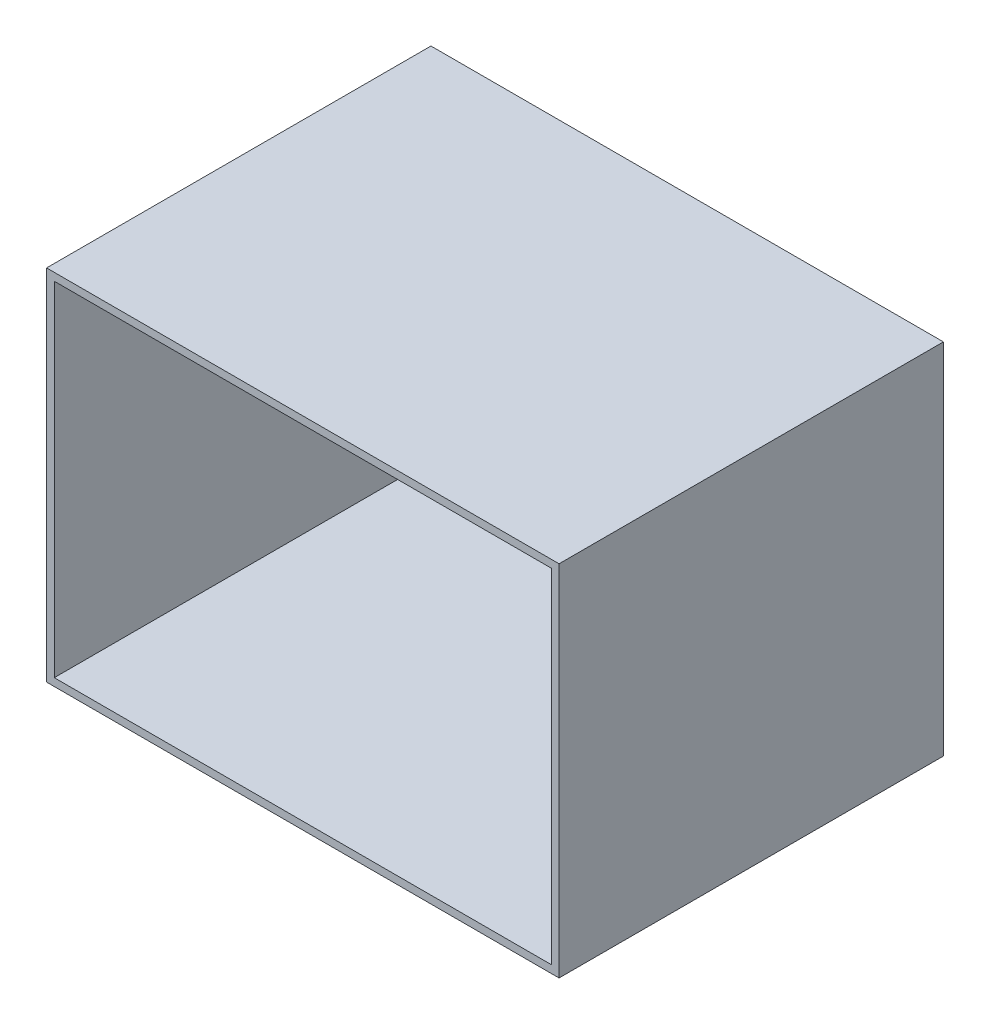
ISO-10303-21;
HEADER;
FILE_DESCRIPTION(('STEP AP214'),'2;1');
FILE_NAME('part.step','',(''),(''),'','','');
FILE_SCHEMA(('AUTOMOTIVE_DESIGN { 1 0 10303 214 1 1 1 1 }'));
ENDSEC;
DATA;
#1=APPLICATION_CONTEXT('core data for automotive mechanical design processes');
#2=APPLICATION_PROTOCOL_DEFINITION('international standard','automotive_design',2000,#1);
#3=PRODUCT_CONTEXT('',#1,'mechanical');
#4=PRODUCT('Part','Part','',(#3));
#5=PRODUCT_RELATED_PRODUCT_CATEGORY('part','',(#4));
#6=PRODUCT_DEFINITION_FORMATION('','',#4);
#7=PRODUCT_DEFINITION_CONTEXT('part definition',#1,'design');
#8=PRODUCT_DEFINITION('design','',#6,#7);
#9=PRODUCT_DEFINITION_SHAPE('','',#8);
#10=(LENGTH_UNIT() NAMED_UNIT(*) SI_UNIT(.MILLI.,.METRE.));
#11=(NAMED_UNIT(*) PLANE_ANGLE_UNIT() SI_UNIT($,.RADIAN.));
#12=(NAMED_UNIT(*) SI_UNIT($,.STERADIAN.) SOLID_ANGLE_UNIT());
#13=UNCERTAINTY_MEASURE_WITH_UNIT(LENGTH_MEASURE(1.E-05),#10,'distance_accuracy_value','');
#14=(GEOMETRIC_REPRESENTATION_CONTEXT(3) GLOBAL_UNCERTAINTY_ASSIGNED_CONTEXT((#13)) GLOBAL_UNIT_ASSIGNED_CONTEXT((#10,
#11,#12)) REPRESENTATION_CONTEXT('',''));
#15=CARTESIAN_POINT('',(0.,0.,0.));
#16=DIRECTION('',(0.,0.,1.));
#17=DIRECTION('',(1.,0.,0.));
#18=AXIS2_PLACEMENT_3D('',#15,#16,#17);
#19=CARTESIAN_POINT('',(0.,3.,0.));
#20=DIRECTION('',(0.,-1.,0.));
#21=DIRECTION('',(0.,0.,-1.));
#22=AXIS2_PLACEMENT_3D('',#19,#20,#21);
#23=PLANE('',#22);
#24=DIRECTION('',(0.,0.,1.));
#25=VECTOR('',#24,1.);
#26=CARTESIAN_POINT('',(197.,3.,-150.));
#27=LINE('',#26,#25);
#28=CARTESIAN_POINT('',(197.,3.,-150.));
#29=VERTEX_POINT('',#28);
#30=CARTESIAN_POINT('',(197.,3.,0.));
#31=VERTEX_POINT('',#30);
#32=EDGE_CURVE('E137',#29,#31,#27,.T.);
#33=ORIENTED_EDGE('',*,*,#32,.F.);
#34=DIRECTION('',(-1.,0.,0.));
#35=VECTOR('',#34,1.);
#36=CARTESIAN_POINT('',(0.,3.,-150.));
#37=LINE('',#36,#35);
#38=CARTESIAN_POINT('',(3.,3.,-150.));
#39=VERTEX_POINT('',#38);
#40=EDGE_CURVE('E171',#29,#39,#37,.T.);
#41=ORIENTED_EDGE('',*,*,#40,.T.);
#42=DIRECTION('',(0.,0.,-1.));
#43=VECTOR('',#42,1.);
#44=CARTESIAN_POINT('',(3.,3.,-150.));
#45=LINE('',#44,#43);
#46=CARTESIAN_POINT('',(3.00000000000001,3.,0.));
#47=VERTEX_POINT('',#46);
#48=EDGE_CURVE('E60',#47,#39,#45,.T.);
#49=ORIENTED_EDGE('',*,*,#48,.F.);
#50=DIRECTION('',(1.,0.,0.));
#51=VECTOR('',#50,1.);
#52=CARTESIAN_POINT('',(0.,3.,0.));
#53=LINE('',#52,#51);
#54=EDGE_CURVE('E55',#47,#31,#53,.T.);
#55=ORIENTED_EDGE('',*,*,#54,.T.);
#56=EDGE_LOOP('',(#33,#41,#49,#55));
#57=FACE_BOUND('',#56,.T.);
#58=ADVANCED_FACE('F39',(#57),#23,.F.);
#59=CARTESIAN_POINT('',(0.,3.,0.));
#60=DIRECTION('',(1.,0.,0.));
#61=DIRECTION('',(0.,0.,-1.));
#62=AXIS2_PLACEMENT_3D('',#59,#60,#61);
#63=PLANE('',#62);
#64=DIRECTION('',(0.,0.,1.));
#65=VECTOR('',#64,1.);
#66=CARTESIAN_POINT('',(0.,0.,0.));
#67=LINE('',#66,#65);
#68=CARTESIAN_POINT('',(0.,0.,-150.));
#69=VERTEX_POINT('',#68);
#70=CARTESIAN_POINT('',(0.,0.,0.));
#71=VERTEX_POINT('',#70);
#72=EDGE_CURVE('E109',#69,#71,#67,.T.);
#73=ORIENTED_EDGE('',*,*,#72,.T.);
#74=DIRECTION('',(0.,-1.,0.));
#75=VECTOR('',#74,1.);
#76=CARTESIAN_POINT('',(0.,3.,0.));
#77=LINE('',#76,#75);
#78=CARTESIAN_POINT('',(0.,140.,0.));
#79=VERTEX_POINT('',#78);
#80=EDGE_CURVE('E11',#79,#71,#77,.T.);
#81=ORIENTED_EDGE('',*,*,#80,.F.);
#82=DIRECTION('',(0.,0.,1.));
#83=VECTOR('',#82,1.);
#84=CARTESIAN_POINT('',(0.,140.,-150.));
#85=LINE('',#84,#83);
#86=CARTESIAN_POINT('',(0.,140.,-150.));
#87=VERTEX_POINT('',#86);
#88=EDGE_CURVE('E107',#87,#79,#85,.T.);
#89=ORIENTED_EDGE('',*,*,#88,.F.);
#90=DIRECTION('',(0.,-1.,0.));
#91=VECTOR('',#90,1.);
#92=CARTESIAN_POINT('',(0.,3.,-150.));
#93=LINE('',#92,#91);
#94=EDGE_CURVE('E175',#87,#69,#93,.T.);
#95=ORIENTED_EDGE('',*,*,#94,.T.);
#96=EDGE_LOOP('',(#73,#81,#89,#95));
#97=FACE_BOUND('',#96,.T.);
#98=ADVANCED_FACE('F41',(#97),#63,.F.);
#99=CARTESIAN_POINT('',(0.,3.,0.));
#100=DIRECTION('',(0.,0.,-1.));
#101=DIRECTION('',(-1.,0.,0.));
#102=AXIS2_PLACEMENT_3D('',#99,#100,#101);
#103=PLANE('',#102);
#104=DIRECTION('',(0.,-1.,0.));
#105=VECTOR('',#104,1.);
#106=CARTESIAN_POINT('',(3.00000000000002,137.,0.));
#107=LINE('',#106,#105);
#108=CARTESIAN_POINT('',(3.00000000000002,137.,0.));
#109=VERTEX_POINT('',#108);
#110=EDGE_CURVE('E165',#109,#47,#107,.T.);
#111=ORIENTED_EDGE('',*,*,#110,.F.);
#112=DIRECTION('',(1.,0.,0.));
#113=VECTOR('',#112,1.);
#114=CARTESIAN_POINT('',(0.,137.,0.));
#115=LINE('',#114,#113);
#116=CARTESIAN_POINT('',(197.,137.,0.));
#117=VERTEX_POINT('',#116);
#118=EDGE_CURVE('E130',#109,#117,#115,.T.);
#119=ORIENTED_EDGE('',*,*,#118,.T.);
#120=DIRECTION('',(0.,-1.,0.));
#121=VECTOR('',#120,1.);
#122=CARTESIAN_POINT('',(197.,137.,0.));
#123=LINE('',#122,#121);
#124=EDGE_CURVE('E145',#117,#31,#123,.T.);
#125=ORIENTED_EDGE('',*,*,#124,.T.);
#126=ORIENTED_EDGE('',*,*,#54,.F.);
#127=EDGE_LOOP('',(#111,#119,#125,#126));
#128=FACE_BOUND('',#127,.T.);
#129=DIRECTION('',(1.,0.,0.));
#130=VECTOR('',#129,1.);
#131=CARTESIAN_POINT('',(0.,0.,0.));
#132=LINE('',#131,#130);
#133=CARTESIAN_POINT('',(200.,0.,0.));
#134=VERTEX_POINT('',#133);
#135=EDGE_CURVE('E178',#71,#134,#132,.T.);
#136=ORIENTED_EDGE('',*,*,#135,.T.);
#137=DIRECTION('',(0.,-1.,0.));
#138=VECTOR('',#137,1.);
#139=CARTESIAN_POINT('',(200.,3.,0.));
#140=LINE('',#139,#138);
#141=CARTESIAN_POINT('',(200.,140.,0.));
#142=VERTEX_POINT('',#141);
#143=EDGE_CURVE('E48',#142,#134,#140,.T.);
#144=ORIENTED_EDGE('',*,*,#143,.F.);
#145=DIRECTION('',(1.,0.,0.));
#146=VECTOR('',#145,1.);
#147=CARTESIAN_POINT('',(0.,140.,0.));
#148=LINE('',#147,#146);
#149=EDGE_CURVE('E112',#79,#142,#148,.T.);
#150=ORIENTED_EDGE('',*,*,#149,.F.);
#151=ORIENTED_EDGE('',*,*,#80,.T.);
#152=EDGE_LOOP('',(#136,#144,#150,#151));
#153=FACE_BOUND('',#152,.T.);
#154=ADVANCED_FACE('F113',(#128,#153),#103,.F.);
#155=CARTESIAN_POINT('',(200.,3.,0.));
#156=DIRECTION('',(-1.,0.,0.));
#157=DIRECTION('',(0.,0.,1.));
#158=AXIS2_PLACEMENT_3D('',#155,#156,#157);
#159=PLANE('',#158);
#160=DIRECTION('',(0.,0.,-1.));
#161=VECTOR('',#160,1.);
#162=CARTESIAN_POINT('',(200.,0.,0.));
#163=LINE('',#162,#161);
#164=CARTESIAN_POINT('',(200.,0.,-150.));
#165=VERTEX_POINT('',#164);
#166=EDGE_CURVE('E181',#134,#165,#163,.T.);
#167=ORIENTED_EDGE('',*,*,#166,.T.);
#168=DIRECTION('',(0.,-1.,0.));
#169=VECTOR('',#168,1.);
#170=CARTESIAN_POINT('',(200.,3.,-150.));
#171=LINE('',#170,#169);
#172=CARTESIAN_POINT('',(200.,140.,-150.));
#173=VERTEX_POINT('',#172);
#174=EDGE_CURVE('E188',#173,#165,#171,.T.);
#175=ORIENTED_EDGE('',*,*,#174,.F.);
#176=DIRECTION('',(0.,0.,-1.));
#177=VECTOR('',#176,1.);
#178=CARTESIAN_POINT('',(200.,140.,-150.));
#179=LINE('',#178,#177);
#180=EDGE_CURVE('E119',#142,#173,#179,.T.);
#181=ORIENTED_EDGE('',*,*,#180,.F.);
#182=ORIENTED_EDGE('',*,*,#143,.T.);
#183=EDGE_LOOP('',(#167,#175,#181,#182));
#184=FACE_BOUND('',#183,.T.);
#185=ADVANCED_FACE('F194',(#184),#159,.F.);
#186=CARTESIAN_POINT('',(0.,3.,-150.));
#187=DIRECTION('',(0.,0.,1.));
#188=DIRECTION('',(1.,0.,0.));
#189=AXIS2_PLACEMENT_3D('',#186,#187,#188);
#190=PLANE('',#189);
#191=ORIENTED_EDGE('',*,*,#94,.F.);
#192=DIRECTION('',(-1.,0.,0.));
#193=VECTOR('',#192,1.);
#194=CARTESIAN_POINT('',(0.,140.,-150.));
#195=LINE('',#194,#193);
#196=EDGE_CURVE('E124',#173,#87,#195,.T.);
#197=ORIENTED_EDGE('',*,*,#196,.F.);
#198=ORIENTED_EDGE('',*,*,#174,.T.);
#199=DIRECTION('',(-1.,0.,0.));
#200=VECTOR('',#199,1.);
#201=CARTESIAN_POINT('',(0.,0.,-150.));
#202=LINE('',#201,#200);
#203=EDGE_CURVE('E172',#165,#69,#202,.T.);
#204=ORIENTED_EDGE('',*,*,#203,.T.);
#205=EDGE_LOOP('',(#191,#197,#198,#204));
#206=FACE_BOUND('',#205,.T.);
#207=DIRECTION('',(-1.,0.,0.));
#208=VECTOR('',#207,1.);
#209=CARTESIAN_POINT('',(0.,137.,-150.));
#210=LINE('',#209,#208);
#211=CARTESIAN_POINT('',(197.,137.,-150.));
#212=VERTEX_POINT('',#211);
#213=CARTESIAN_POINT('',(3.,137.,-150.));
#214=VERTEX_POINT('',#213);
#215=EDGE_CURVE('E126',#212,#214,#210,.T.);
#216=ORIENTED_EDGE('',*,*,#215,.T.);
#217=DIRECTION('',(0.,-1.,0.));
#218=VECTOR('',#217,1.);
#219=CARTESIAN_POINT('',(3.,137.,-150.));
#220=LINE('',#219,#218);
#221=EDGE_CURVE('E159',#214,#39,#220,.T.);
#222=ORIENTED_EDGE('',*,*,#221,.T.);
#223=ORIENTED_EDGE('',*,*,#40,.F.);
#224=DIRECTION('',(0.,-1.,0.));
#225=VECTOR('',#224,1.);
#226=CARTESIAN_POINT('',(197.,137.,-150.));
#227=LINE('',#226,#225);
#228=EDGE_CURVE('E151',#212,#29,#227,.T.);
#229=ORIENTED_EDGE('',*,*,#228,.F.);
#230=EDGE_LOOP('',(#216,#222,#223,#229));
#231=FACE_BOUND('',#230,.T.);
#232=ADVANCED_FACE('F199',(#206,#231),#190,.F.);
#233=CARTESIAN_POINT('',(0.,0.,0.));
#234=DIRECTION('',(0.,-1.,0.));
#235=DIRECTION('',(0.,0.,-1.));
#236=AXIS2_PLACEMENT_3D('',#233,#234,#235);
#237=PLANE('',#236);
#238=ORIENTED_EDGE('',*,*,#72,.F.);
#239=ORIENTED_EDGE('',*,*,#203,.F.);
#240=ORIENTED_EDGE('',*,*,#166,.F.);
#241=ORIENTED_EDGE('',*,*,#135,.F.);
#242=EDGE_LOOP('',(#238,#239,#240,#241));
#243=FACE_BOUND('',#242,.T.);
#244=ADVANCED_FACE('F197',(#243),#237,.T.);
#245=CARTESIAN_POINT('',(3.,137.,-150.));
#246=DIRECTION('',(-1.,0.,0.));
#247=DIRECTION('',(0.,0.,1.));
#248=AXIS2_PLACEMENT_3D('',#245,#246,#247);
#249=PLANE('',#248);
#250=ORIENTED_EDGE('',*,*,#48,.T.);
#251=ORIENTED_EDGE('',*,*,#221,.F.);
#252=DIRECTION('',(0.,0.,-1.));
#253=VECTOR('',#252,1.);
#254=CARTESIAN_POINT('',(3.,137.,-150.));
#255=LINE('',#254,#253);
#256=EDGE_CURVE('E155',#109,#214,#255,.T.);
#257=ORIENTED_EDGE('',*,*,#256,.F.);
#258=ORIENTED_EDGE('',*,*,#110,.T.);
#259=EDGE_LOOP('',(#250,#251,#257,#258));
#260=FACE_BOUND('',#259,.T.);
#261=ADVANCED_FACE('F210',(#260),#249,.F.);
#262=CARTESIAN_POINT('',(197.,137.,-150.));
#263=DIRECTION('',(1.,0.,0.));
#264=DIRECTION('',(0.,0.,-1.));
#265=AXIS2_PLACEMENT_3D('',#262,#263,#264);
#266=PLANE('',#265);
#267=ORIENTED_EDGE('',*,*,#32,.T.);
#268=ORIENTED_EDGE('',*,*,#124,.F.);
#269=DIRECTION('',(0.,0.,1.));
#270=VECTOR('',#269,1.);
#271=CARTESIAN_POINT('',(197.,137.,-150.));
#272=LINE('',#271,#270);
#273=EDGE_CURVE('E141',#212,#117,#272,.T.);
#274=ORIENTED_EDGE('',*,*,#273,.F.);
#275=ORIENTED_EDGE('',*,*,#228,.T.);
#276=EDGE_LOOP('',(#267,#268,#274,#275));
#277=FACE_BOUND('',#276,.T.);
#278=ADVANCED_FACE('F213',(#277),#266,.F.);
#279=CARTESIAN_POINT('',(0.,137.,0.));
#280=DIRECTION('',(0.,1.,0.));
#281=DIRECTION('',(0.,0.,1.));
#282=AXIS2_PLACEMENT_3D('',#279,#280,#281);
#283=PLANE('',#282);
#284=ORIENTED_EDGE('',*,*,#118,.F.);
#285=ORIENTED_EDGE('',*,*,#256,.T.);
#286=ORIENTED_EDGE('',*,*,#215,.F.);
#287=ORIENTED_EDGE('',*,*,#273,.T.);
#288=EDGE_LOOP('',(#284,#285,#286,#287));
#289=FACE_BOUND('',#288,.T.);
#290=ADVANCED_FACE('F207',(#289),#283,.F.);
#291=CARTESIAN_POINT('',(0.,140.,0.));
#292=DIRECTION('',(0.,1.,0.));
#293=DIRECTION('',(0.,0.,1.));
#294=AXIS2_PLACEMENT_3D('',#291,#292,#293);
#295=PLANE('',#294);
#296=ORIENTED_EDGE('',*,*,#88,.T.);
#297=ORIENTED_EDGE('',*,*,#149,.T.);
#298=ORIENTED_EDGE('',*,*,#180,.T.);
#299=ORIENTED_EDGE('',*,*,#196,.T.);
#300=EDGE_LOOP('',(#296,#297,#298,#299));
#301=FACE_BOUND('',#300,.T.);
#302=ADVANCED_FACE('F122',(#301),#295,.T.);
#303=CLOSED_SHELL('',(#58,#98,#154,#185,#232,#244,#261,#278,#290,#302));
#304=MANIFOLD_SOLID_BREP('B2',#303);
#305=ADVANCED_BREP_SHAPE_REPRESENTATION('',(#18,#304),#14);
#306=SHAPE_DEFINITION_REPRESENTATION(#9,#305);
ENDSEC;
END-ISO-10303-21;
